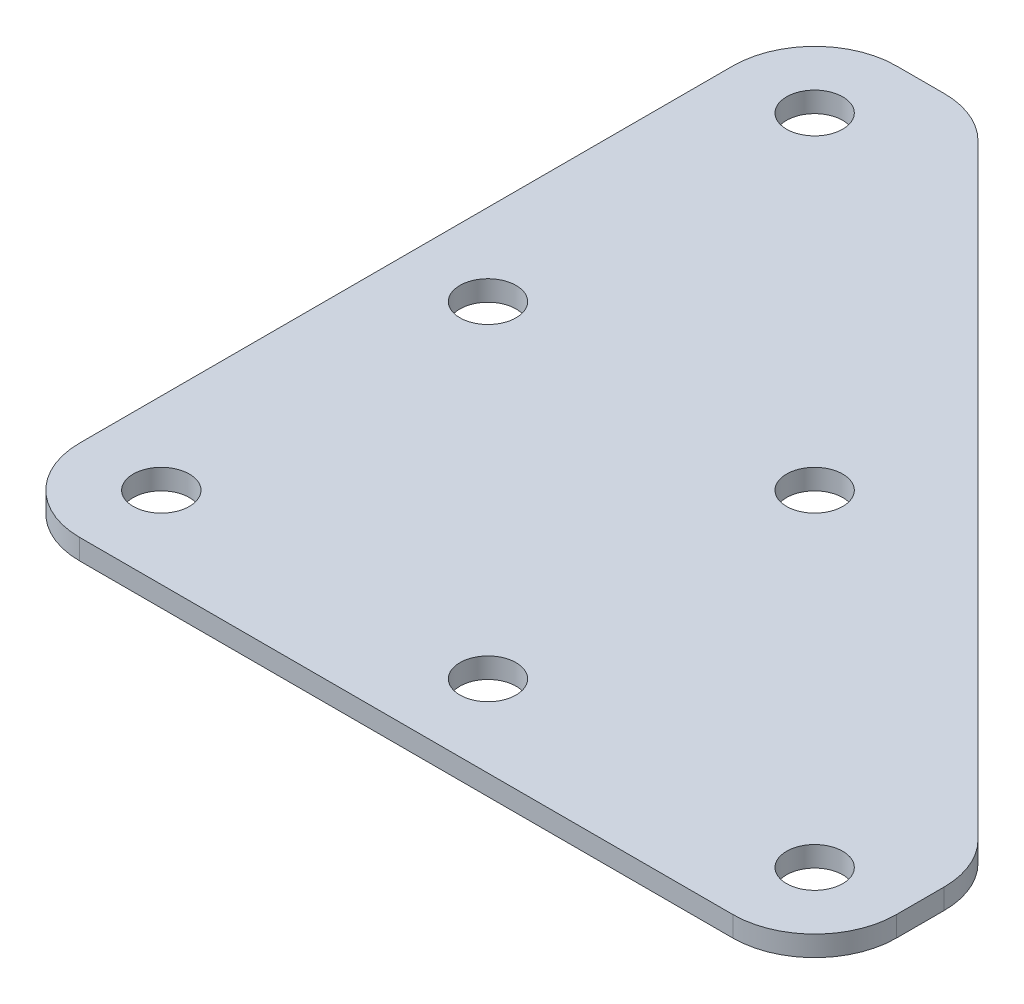
ISO-10303-21;
HEADER;
FILE_DESCRIPTION(('STEP AP214'),'2;1');
FILE_NAME('part.step','',(''),(''),'','','');
FILE_SCHEMA(('AUTOMOTIVE_DESIGN { 1 0 10303 214 1 1 1 1 }'));
ENDSEC;
DATA;
#1=APPLICATION_CONTEXT('core data for automotive mechanical design processes');
#2=APPLICATION_PROTOCOL_DEFINITION('international standard','automotive_design',2000,#1);
#3=PRODUCT_CONTEXT('',#1,'mechanical');
#4=PRODUCT('Part','Part','',(#3));
#5=PRODUCT_RELATED_PRODUCT_CATEGORY('part','',(#4));
#6=PRODUCT_DEFINITION_FORMATION('','',#4);
#7=PRODUCT_DEFINITION_CONTEXT('part definition',#1,'design');
#8=PRODUCT_DEFINITION('design','',#6,#7);
#9=PRODUCT_DEFINITION_SHAPE('','',#8);
#10=(LENGTH_UNIT() NAMED_UNIT(*) SI_UNIT(.MILLI.,.METRE.));
#11=(NAMED_UNIT(*) PLANE_ANGLE_UNIT() SI_UNIT($,.RADIAN.));
#12=(NAMED_UNIT(*) SI_UNIT($,.STERADIAN.) SOLID_ANGLE_UNIT());
#13=UNCERTAINTY_MEASURE_WITH_UNIT(LENGTH_MEASURE(1.E-05),#10,'distance_accuracy_value','');
#14=(GEOMETRIC_REPRESENTATION_CONTEXT(3) GLOBAL_UNCERTAINTY_ASSIGNED_CONTEXT((#13)) GLOBAL_UNIT_ASSIGNED_CONTEXT((#10,
#11,#12)) REPRESENTATION_CONTEXT('',''));
#15=CARTESIAN_POINT('',(0.,0.,0.));
#16=DIRECTION('',(0.,0.,1.));
#17=DIRECTION('',(1.,0.,0.));
#18=AXIS2_PLACEMENT_3D('',#15,#16,#17);
#19=CARTESIAN_POINT('',(50.8,0.79375,0.));
#20=DIRECTION('',(0.,-1.,0.));
#21=DIRECTION('',(0.,0.,-1.));
#22=AXIS2_PLACEMENT_3D('',#19,#20,#21);
#23=PLANE('',#22);
#24=CARTESIAN_POINT('',(50.8,0.79375,0.));
#25=DIRECTION('',(0.,1.,0.));
#26=DIRECTION('',(0.,0.,-1.));
#27=AXIS2_PLACEMENT_3D('',#24,#25,#26);
#28=CIRCLE('',#27,6.35);
#29=CARTESIAN_POINT('',(50.8,0.79375,6.34999999999999));
#30=VERTEX_POINT('',#29);
#31=CARTESIAN_POINT('',(57.15,0.79375,0.));
#32=VERTEX_POINT('',#31);
#33=EDGE_CURVE('E182',#30,#32,#28,.T.);
#34=ORIENTED_EDGE('',*,*,#33,.T.);
#35=DIRECTION('',(0.,0.,-1.));
#36=VECTOR('',#35,1.);
#37=CARTESIAN_POINT('',(57.15,0.79375,-3.71974387893083));
#38=LINE('',#37,#36);
#39=CARTESIAN_POINT('',(57.15,0.79375,-3.71974387893083));
#40=VERTEX_POINT('',#39);
#41=EDGE_CURVE('E106',#32,#40,#38,.T.);
#42=ORIENTED_EDGE('',*,*,#41,.T.);
#43=CARTESIAN_POINT('',(50.8,0.79375,-3.71974387893085));
#44=DIRECTION('',(0.,1.,0.));
#45=DIRECTION('',(0.,0.,-1.));
#46=AXIS2_PLACEMENT_3D('',#43,#44,#45);
#47=CIRCLE('',#46,6.35);
#48=CARTESIAN_POINT('',(55.2901280605346,0.79375,-8.20987193946545));
#49=VERTEX_POINT('',#48);
#50=EDGE_CURVE('E211',#40,#49,#47,.T.);
#51=ORIENTED_EDGE('',*,*,#50,.T.);
#52=DIRECTION('',(-0.707106781186548,0.,-0.707106781186547));
#53=VECTOR('',#52,1.);
#54=CARTESIAN_POINT('',(8.20987193946544,0.79375,-55.2901280605346));
#55=LINE('',#54,#53);
#56=CARTESIAN_POINT('',(8.20987193946544,0.79375,-55.2901280605346));
#57=VERTEX_POINT('',#56);
#58=EDGE_CURVE('E231',#49,#57,#55,.T.);
#59=ORIENTED_EDGE('',*,*,#58,.T.);
#60=CARTESIAN_POINT('',(3.71974387893085,0.79375,-50.8));
#61=DIRECTION('',(0.,1.,0.));
#62=DIRECTION('',(0.,0.,-1.));
#63=AXIS2_PLACEMENT_3D('',#60,#61,#62);
#64=CIRCLE('',#63,6.35);
#65=CARTESIAN_POINT('',(3.71974387893082,0.79375,-57.15));
#66=VERTEX_POINT('',#65);
#67=EDGE_CURVE('E227',#57,#66,#64,.T.);
#68=ORIENTED_EDGE('',*,*,#67,.T.);
#69=DIRECTION('',(-1.,0.,0.));
#70=VECTOR('',#69,1.);
#71=CARTESIAN_POINT('',(0.,0.79375,-57.15));
#72=LINE('',#71,#70);
#73=CARTESIAN_POINT('',(0.,0.79375,-57.15));
#74=VERTEX_POINT('',#73);
#75=EDGE_CURVE('E230',#66,#74,#72,.T.);
#76=ORIENTED_EDGE('',*,*,#75,.T.);
#77=CARTESIAN_POINT('',(0.,0.79375,-50.8));
#78=DIRECTION('',(0.,1.,0.));
#79=DIRECTION('',(0.,0.,-1.));
#80=AXIS2_PLACEMENT_3D('',#77,#78,#79);
#81=CIRCLE('',#80,6.35);
#82=CARTESIAN_POINT('',(-6.35,0.79375,-50.7999999999999));
#83=VERTEX_POINT('',#82);
#84=EDGE_CURVE('E131',#74,#83,#81,.T.);
#85=ORIENTED_EDGE('',*,*,#84,.T.);
#86=DIRECTION('',(0.,0.,1.));
#87=VECTOR('',#86,1.);
#88=CARTESIAN_POINT('',(-6.35,0.79375,0.));
#89=LINE('',#88,#87);
#90=CARTESIAN_POINT('',(-6.35,0.79375,0.));
#91=VERTEX_POINT('',#90);
#92=EDGE_CURVE('E125',#83,#91,#89,.T.);
#93=ORIENTED_EDGE('',*,*,#92,.T.);
#94=CARTESIAN_POINT('',(0.,0.79375,0.));
#95=DIRECTION('',(0.,1.,0.));
#96=DIRECTION('',(0.,0.,1.));
#97=AXIS2_PLACEMENT_3D('',#94,#95,#96);
#98=CIRCLE('',#97,6.35);
#99=CARTESIAN_POINT('',(0.,0.79375,6.35));
#100=VERTEX_POINT('',#99);
#101=EDGE_CURVE('E129',#91,#100,#98,.T.);
#102=ORIENTED_EDGE('',*,*,#101,.T.);
#103=DIRECTION('',(1.,0.,0.));
#104=VECTOR('',#103,1.);
#105=CARTESIAN_POINT('',(50.8,0.79375,6.34999999999999));
#106=LINE('',#105,#104);
#107=EDGE_CURVE('E57',#100,#30,#106,.T.);
#108=ORIENTED_EDGE('',*,*,#107,.T.);
#109=EDGE_LOOP('',(#34,#42,#51,#59,#68,#76,#85,#93,#102,#108));
#110=FACE_BOUND('',#109,.T.);
#111=CARTESIAN_POINT('',(0.,0.79375,0.));
#112=DIRECTION('',(0.,1.,0.));
#113=DIRECTION('',(0.,0.,1.));
#114=AXIS2_PLACEMENT_3D('',#111,#112,#113);
#115=CIRCLE('',#114,2.1828125);
#116=CARTESIAN_POINT('',(0.,0.79375,2.1828125));
#117=VERTEX_POINT('',#116);
#118=EDGE_CURVE('E158',#117,#117,#115,.T.);
#119=ORIENTED_EDGE('',*,*,#118,.F.);
#120=EDGE_LOOP('',(#119));
#121=FACE_BOUND('',#120,.T.);
#122=CARTESIAN_POINT('',(0.,0.79375,-50.8));
#123=DIRECTION('',(0.,1.,0.));
#124=DIRECTION('',(0.,0.,1.));
#125=AXIS2_PLACEMENT_3D('',#122,#123,#124);
#126=CIRCLE('',#125,2.1828125);
#127=CARTESIAN_POINT('',(0.,0.79375,-48.6171875));
#128=VERTEX_POINT('',#127);
#129=EDGE_CURVE('E249',#128,#128,#126,.T.);
#130=ORIENTED_EDGE('',*,*,#129,.F.);
#131=EDGE_LOOP('',(#130));
#132=FACE_BOUND('',#131,.T.);
#133=CARTESIAN_POINT('',(50.8,0.79375,0.));
#134=DIRECTION('',(0.,1.,0.));
#135=DIRECTION('',(0.,0.,1.));
#136=AXIS2_PLACEMENT_3D('',#133,#134,#135);
#137=CIRCLE('',#136,2.1828125);
#138=CARTESIAN_POINT('',(50.8,0.79375,2.1828125));
#139=VERTEX_POINT('',#138);
#140=EDGE_CURVE('E257',#139,#139,#137,.T.);
#141=ORIENTED_EDGE('',*,*,#140,.F.);
#142=EDGE_LOOP('',(#141));
#143=FACE_BOUND('',#142,.T.);
#144=CARTESIAN_POINT('',(0.,0.79375,-25.4));
#145=DIRECTION('',(0.,1.,0.));
#146=DIRECTION('',(0.,0.,1.));
#147=AXIS2_PLACEMENT_3D('',#144,#145,#146);
#148=CIRCLE('',#147,2.1828125);
#149=CARTESIAN_POINT('',(0.,0.79375,-23.2171875));
#150=VERTEX_POINT('',#149);
#151=EDGE_CURVE('E265',#150,#150,#148,.T.);
#152=ORIENTED_EDGE('',*,*,#151,.F.);
#153=EDGE_LOOP('',(#152));
#154=FACE_BOUND('',#153,.T.);
#155=CARTESIAN_POINT('',(25.4,0.79375,0.));
#156=DIRECTION('',(0.,1.,0.));
#157=DIRECTION('',(0.,0.,1.));
#158=AXIS2_PLACEMENT_3D('',#155,#156,#157);
#159=CIRCLE('',#158,2.1828125);
#160=CARTESIAN_POINT('',(25.4,0.79375,2.1828125));
#161=VERTEX_POINT('',#160);
#162=EDGE_CURVE('E273',#161,#161,#159,.T.);
#163=ORIENTED_EDGE('',*,*,#162,.F.);
#164=EDGE_LOOP('',(#163));
#165=FACE_BOUND('',#164,.T.);
#166=CARTESIAN_POINT('',(25.4,0.79375,-25.4));
#167=DIRECTION('',(0.,1.,0.));
#168=DIRECTION('',(0.,0.,1.));
#169=AXIS2_PLACEMENT_3D('',#166,#167,#168);
#170=CIRCLE('',#169,2.1828125);
#171=CARTESIAN_POINT('',(25.4,0.79375,-23.2171875));
#172=VERTEX_POINT('',#171);
#173=EDGE_CURVE('E281',#172,#172,#170,.T.);
#174=ORIENTED_EDGE('',*,*,#173,.F.);
#175=EDGE_LOOP('',(#174));
#176=FACE_BOUND('',#175,.T.);
#177=ADVANCED_FACE('F39',(#110,#121,#132,#143,#154,#165,#176),#23,.F.);
#178=CARTESIAN_POINT('',(50.8,-0.79375,0.));
#179=DIRECTION('',(0.,-1.,0.));
#180=DIRECTION('',(0.,0.,-1.));
#181=AXIS2_PLACEMENT_3D('',#178,#179,#180);
#182=PLANE('',#181);
#183=CARTESIAN_POINT('',(25.4,-0.79375,0.));
#184=DIRECTION('',(0.,1.,0.));
#185=DIRECTION('',(0.,0.,1.));
#186=AXIS2_PLACEMENT_3D('',#183,#184,#185);
#187=CIRCLE('',#186,2.1828125);
#188=CARTESIAN_POINT('',(25.4,-0.79375,2.1828125));
#189=VERTEX_POINT('',#188);
#190=EDGE_CURVE('E277',#189,#189,#187,.T.);
#191=ORIENTED_EDGE('',*,*,#190,.T.);
#192=EDGE_LOOP('',(#191));
#193=FACE_BOUND('',#192,.T.);
#194=CARTESIAN_POINT('',(50.8,-0.79375,0.));
#195=DIRECTION('',(0.,1.,0.));
#196=DIRECTION('',(0.,0.,1.));
#197=AXIS2_PLACEMENT_3D('',#194,#195,#196);
#198=CIRCLE('',#197,2.1828125);
#199=CARTESIAN_POINT('',(50.8,-0.79375,2.1828125));
#200=VERTEX_POINT('',#199);
#201=EDGE_CURVE('E261',#200,#200,#198,.T.);
#202=ORIENTED_EDGE('',*,*,#201,.T.);
#203=EDGE_LOOP('',(#202));
#204=FACE_BOUND('',#203,.T.);
#205=CARTESIAN_POINT('',(0.,-0.79375,0.));
#206=DIRECTION('',(0.,1.,0.));
#207=DIRECTION('',(0.,0.,1.));
#208=AXIS2_PLACEMENT_3D('',#205,#206,#207);
#209=CIRCLE('',#208,2.1828125);
#210=CARTESIAN_POINT('',(0.,-0.79375,2.1828125));
#211=VERTEX_POINT('',#210);
#212=EDGE_CURVE('E245',#211,#211,#209,.T.);
#213=ORIENTED_EDGE('',*,*,#212,.T.);
#214=EDGE_LOOP('',(#213));
#215=FACE_BOUND('',#214,.T.);
#216=CARTESIAN_POINT('',(50.8,-0.79375,0.));
#217=DIRECTION('',(0.,1.,0.));
#218=DIRECTION('',(0.,0.,-1.));
#219=AXIS2_PLACEMENT_3D('',#216,#217,#218);
#220=CIRCLE('',#219,6.35);
#221=CARTESIAN_POINT('',(50.8,-0.79375,6.34999999999999));
#222=VERTEX_POINT('',#221);
#223=CARTESIAN_POINT('',(57.15,-0.79375,0.));
#224=VERTEX_POINT('',#223);
#225=EDGE_CURVE('E153',#222,#224,#220,.T.);
#226=ORIENTED_EDGE('',*,*,#225,.F.);
#227=DIRECTION('',(1.,0.,0.));
#228=VECTOR('',#227,1.);
#229=CARTESIAN_POINT('',(50.8,-0.79375,6.34999999999999));
#230=LINE('',#229,#228);
#231=CARTESIAN_POINT('',(0.,-0.79375,6.35));
#232=VERTEX_POINT('',#231);
#233=EDGE_CURVE('E98',#232,#222,#230,.T.);
#234=ORIENTED_EDGE('',*,*,#233,.F.);
#235=CARTESIAN_POINT('',(0.,-0.79375,0.));
#236=DIRECTION('',(0.,1.,0.));
#237=DIRECTION('',(0.,0.,1.));
#238=AXIS2_PLACEMENT_3D('',#235,#236,#237);
#239=CIRCLE('',#238,6.35);
#240=CARTESIAN_POINT('',(-6.35,-0.79375,0.));
#241=VERTEX_POINT('',#240);
#242=EDGE_CURVE('E92',#241,#232,#239,.T.);
#243=ORIENTED_EDGE('',*,*,#242,.F.);
#244=DIRECTION('',(0.,0.,1.));
#245=VECTOR('',#244,1.);
#246=CARTESIAN_POINT('',(-6.35,-0.79375,0.));
#247=LINE('',#246,#245);
#248=CARTESIAN_POINT('',(-6.35,-0.79375,-50.7999999999999));
#249=VERTEX_POINT('',#248);
#250=EDGE_CURVE('E140',#249,#241,#247,.T.);
#251=ORIENTED_EDGE('',*,*,#250,.F.);
#252=CARTESIAN_POINT('',(0.,-0.79375,-50.8));
#253=DIRECTION('',(0.,1.,0.));
#254=DIRECTION('',(0.,0.,-1.));
#255=AXIS2_PLACEMENT_3D('',#252,#253,#254);
#256=CIRCLE('',#255,6.35);
#257=CARTESIAN_POINT('',(0.,-0.79375,-57.15));
#258=VERTEX_POINT('',#257);
#259=EDGE_CURVE('E173',#258,#249,#256,.T.);
#260=ORIENTED_EDGE('',*,*,#259,.F.);
#261=DIRECTION('',(-1.,0.,0.));
#262=VECTOR('',#261,1.);
#263=CARTESIAN_POINT('',(0.,-0.79375,-57.15));
#264=LINE('',#263,#262);
#265=CARTESIAN_POINT('',(3.71974387893082,-0.79375,-57.15));
#266=VERTEX_POINT('',#265);
#267=EDGE_CURVE('E170',#266,#258,#264,.T.);
#268=ORIENTED_EDGE('',*,*,#267,.F.);
#269=CARTESIAN_POINT('',(3.71974387893085,-0.79375,-50.8));
#270=DIRECTION('',(0.,1.,0.));
#271=DIRECTION('',(0.,0.,-1.));
#272=AXIS2_PLACEMENT_3D('',#269,#270,#271);
#273=CIRCLE('',#272,6.35);
#274=CARTESIAN_POINT('',(8.20987193946544,-0.79375,-55.2901280605346));
#275=VERTEX_POINT('',#274);
#276=EDGE_CURVE('E167',#275,#266,#273,.T.);
#277=ORIENTED_EDGE('',*,*,#276,.F.);
#278=DIRECTION('',(-0.707106781186548,0.,-0.707106781186547));
#279=VECTOR('',#278,1.);
#280=CARTESIAN_POINT('',(8.20987193946544,-0.79375,-55.2901280605346));
#281=LINE('',#280,#279);
#282=CARTESIAN_POINT('',(55.2901280605346,-0.79375,-8.20987193946545));
#283=VERTEX_POINT('',#282);
#284=EDGE_CURVE('E164',#283,#275,#281,.T.);
#285=ORIENTED_EDGE('',*,*,#284,.F.);
#286=CARTESIAN_POINT('',(50.8,-0.79375,-3.71974387893085));
#287=DIRECTION('',(0.,1.,0.));
#288=DIRECTION('',(0.,0.,-1.));
#289=AXIS2_PLACEMENT_3D('',#286,#287,#288);
#290=CIRCLE('',#289,6.35);
#291=CARTESIAN_POINT('',(57.15,-0.79375,-3.71974387893083));
#292=VERTEX_POINT('',#291);
#293=EDGE_CURVE('E161',#292,#283,#290,.T.);
#294=ORIENTED_EDGE('',*,*,#293,.F.);
#295=DIRECTION('',(0.,0.,-1.));
#296=VECTOR('',#295,1.);
#297=CARTESIAN_POINT('',(57.15,-0.79375,-3.71974387893083));
#298=LINE('',#297,#296);
#299=EDGE_CURVE('E157',#224,#292,#298,.T.);
#300=ORIENTED_EDGE('',*,*,#299,.F.);
#301=EDGE_LOOP('',(#226,#234,#243,#251,#260,#268,#277,#285,#294,#300));
#302=FACE_BOUND('',#301,.T.);
#303=CARTESIAN_POINT('',(0.,-0.79375,-50.8));
#304=DIRECTION('',(0.,1.,0.));
#305=DIRECTION('',(0.,0.,1.));
#306=AXIS2_PLACEMENT_3D('',#303,#304,#305);
#307=CIRCLE('',#306,2.1828125);
#308=CARTESIAN_POINT('',(0.,-0.79375,-48.6171875));
#309=VERTEX_POINT('',#308);
#310=EDGE_CURVE('E253',#309,#309,#307,.T.);
#311=ORIENTED_EDGE('',*,*,#310,.T.);
#312=EDGE_LOOP('',(#311));
#313=FACE_BOUND('',#312,.T.);
#314=CARTESIAN_POINT('',(0.,-0.79375,-25.4));
#315=DIRECTION('',(0.,1.,0.));
#316=DIRECTION('',(0.,0.,1.));
#317=AXIS2_PLACEMENT_3D('',#314,#315,#316);
#318=CIRCLE('',#317,2.1828125);
#319=CARTESIAN_POINT('',(0.,-0.79375,-23.2171875));
#320=VERTEX_POINT('',#319);
#321=EDGE_CURVE('E269',#320,#320,#318,.T.);
#322=ORIENTED_EDGE('',*,*,#321,.T.);
#323=EDGE_LOOP('',(#322));
#324=FACE_BOUND('',#323,.T.);
#325=CARTESIAN_POINT('',(25.4,-0.79375,-25.4));
#326=DIRECTION('',(0.,1.,0.));
#327=DIRECTION('',(0.,0.,1.));
#328=AXIS2_PLACEMENT_3D('',#325,#326,#327);
#329=CIRCLE('',#328,2.1828125);
#330=CARTESIAN_POINT('',(25.4,-0.79375,-23.2171875));
#331=VERTEX_POINT('',#330);
#332=EDGE_CURVE('E285',#331,#331,#329,.T.);
#333=ORIENTED_EDGE('',*,*,#332,.T.);
#334=EDGE_LOOP('',(#333));
#335=FACE_BOUND('',#334,.T.);
#336=ADVANCED_FACE('F215',(#193,#204,#215,#302,#313,#324,#335),#182,.T.);
#337=CARTESIAN_POINT('',(50.8,0.79375,0.));
#338=DIRECTION('',(0.,-1.,0.));
#339=DIRECTION('',(0.,0.,-1.));
#340=AXIS2_PLACEMENT_3D('',#337,#338,#339);
#341=CYLINDRICAL_SURFACE('',#340,6.35);
#342=ORIENTED_EDGE('',*,*,#225,.T.);
#343=DIRECTION('',(0.,-1.,0.));
#344=VECTOR('',#343,1.);
#345=CARTESIAN_POINT('',(57.15,0.79375,0.));
#346=LINE('',#345,#344);
#347=EDGE_CURVE('E11',#32,#224,#346,.T.);
#348=ORIENTED_EDGE('',*,*,#347,.F.);
#349=ORIENTED_EDGE('',*,*,#33,.F.);
#350=DIRECTION('',(0.,-1.,0.));
#351=VECTOR('',#350,1.);
#352=CARTESIAN_POINT('',(50.8,0.79375,6.34999999999999));
#353=LINE('',#352,#351);
#354=EDGE_CURVE('E149',#30,#222,#353,.T.);
#355=ORIENTED_EDGE('',*,*,#354,.T.);
#356=EDGE_LOOP('',(#342,#348,#349,#355));
#357=FACE_BOUND('',#356,.T.);
#358=ADVANCED_FACE('F41',(#357),#341,.T.);
#359=CARTESIAN_POINT('',(57.15,0.79375,-3.71974387893083));
#360=DIRECTION('',(-1.,0.,0.));
#361=DIRECTION('',(0.,0.,1.));
#362=AXIS2_PLACEMENT_3D('',#359,#360,#361);
#363=PLANE('',#362);
#364=ORIENTED_EDGE('',*,*,#299,.T.);
#365=DIRECTION('',(0.,-1.,0.));
#366=VECTOR('',#365,1.);
#367=CARTESIAN_POINT('',(57.15,0.79375,-3.71974387893083));
#368=LINE('',#367,#366);
#369=EDGE_CURVE('E49',#40,#292,#368,.T.);
#370=ORIENTED_EDGE('',*,*,#369,.F.);
#371=ORIENTED_EDGE('',*,*,#41,.F.);
#372=ORIENTED_EDGE('',*,*,#347,.T.);
#373=EDGE_LOOP('',(#364,#370,#371,#372));
#374=FACE_BOUND('',#373,.T.);
#375=ADVANCED_FACE('F327',(#374),#363,.F.);
#376=CARTESIAN_POINT('',(50.8,0.79375,-3.71974387893085));
#377=DIRECTION('',(0.,-1.,0.));
#378=DIRECTION('',(0.,0.,-1.));
#379=AXIS2_PLACEMENT_3D('',#376,#377,#378);
#380=CYLINDRICAL_SURFACE('',#379,6.35);
#381=ORIENTED_EDGE('',*,*,#293,.T.);
#382=DIRECTION('',(0.,-1.,0.));
#383=VECTOR('',#382,1.);
#384=CARTESIAN_POINT('',(55.2901280605346,0.79375,-8.20987193946545));
#385=LINE('',#384,#383);
#386=EDGE_CURVE('E201',#49,#283,#385,.T.);
#387=ORIENTED_EDGE('',*,*,#386,.F.);
#388=ORIENTED_EDGE('',*,*,#50,.F.);
#389=ORIENTED_EDGE('',*,*,#369,.T.);
#390=EDGE_LOOP('',(#381,#387,#388,#389));
#391=FACE_BOUND('',#390,.T.);
#392=ADVANCED_FACE('F209',(#391),#380,.T.);
#393=CARTESIAN_POINT('',(8.20987193946544,0.79375,-55.2901280605346));
#394=DIRECTION('',(-0.707106781186547,0.,0.707106781186548));
#395=DIRECTION('',(0.707106781186548,0.,0.707106781186547));
#396=AXIS2_PLACEMENT_3D('',#393,#394,#395);
#397=PLANE('',#396);
#398=ORIENTED_EDGE('',*,*,#284,.T.);
#399=DIRECTION('',(0.,-1.,0.));
#400=VECTOR('',#399,1.);
#401=CARTESIAN_POINT('',(8.20987193946544,0.79375,-55.2901280605346));
#402=LINE('',#401,#400);
#403=EDGE_CURVE('E197',#57,#275,#402,.T.);
#404=ORIENTED_EDGE('',*,*,#403,.F.);
#405=ORIENTED_EDGE('',*,*,#58,.F.);
#406=ORIENTED_EDGE('',*,*,#386,.T.);
#407=EDGE_LOOP('',(#398,#404,#405,#406));
#408=FACE_BOUND('',#407,.T.);
#409=ADVANCED_FACE('F221',(#408),#397,.F.);
#410=CARTESIAN_POINT('',(3.71974387893085,0.79375,-50.8));
#411=DIRECTION('',(0.,-1.,0.));
#412=DIRECTION('',(0.,0.,-1.));
#413=AXIS2_PLACEMENT_3D('',#410,#411,#412);
#414=CYLINDRICAL_SURFACE('',#413,6.35);
#415=ORIENTED_EDGE('',*,*,#276,.T.);
#416=DIRECTION('',(0.,-1.,0.));
#417=VECTOR('',#416,1.);
#418=CARTESIAN_POINT('',(3.71974387893082,0.79375,-57.15));
#419=LINE('',#418,#417);
#420=EDGE_CURVE('E193',#66,#266,#419,.T.);
#421=ORIENTED_EDGE('',*,*,#420,.F.);
#422=ORIENTED_EDGE('',*,*,#67,.F.);
#423=ORIENTED_EDGE('',*,*,#403,.T.);
#424=EDGE_LOOP('',(#415,#421,#422,#423));
#425=FACE_BOUND('',#424,.T.);
#426=ADVANCED_FACE('F225',(#425),#414,.T.);
#427=CARTESIAN_POINT('',(0.,0.79375,-57.15));
#428=DIRECTION('',(0.,0.,1.));
#429=DIRECTION('',(1.,0.,0.));
#430=AXIS2_PLACEMENT_3D('',#427,#428,#429);
#431=PLANE('',#430);
#432=ORIENTED_EDGE('',*,*,#267,.T.);
#433=DIRECTION('',(0.,-1.,0.));
#434=VECTOR('',#433,1.);
#435=CARTESIAN_POINT('',(0.,0.79375,-57.15));
#436=LINE('',#435,#434);
#437=EDGE_CURVE('E189',#74,#258,#436,.T.);
#438=ORIENTED_EDGE('',*,*,#437,.F.);
#439=ORIENTED_EDGE('',*,*,#75,.F.);
#440=ORIENTED_EDGE('',*,*,#420,.T.);
#441=EDGE_LOOP('',(#432,#438,#439,#440));
#442=FACE_BOUND('',#441,.T.);
#443=ADVANCED_FACE('F317',(#442),#431,.F.);
#444=CARTESIAN_POINT('',(0.,0.79375,-50.8));
#445=DIRECTION('',(0.,-1.,0.));
#446=DIRECTION('',(0.,0.,-1.));
#447=AXIS2_PLACEMENT_3D('',#444,#445,#446);
#448=CYLINDRICAL_SURFACE('',#447,6.35);
#449=ORIENTED_EDGE('',*,*,#259,.T.);
#450=DIRECTION('',(0.,-1.,0.));
#451=VECTOR('',#450,1.);
#452=CARTESIAN_POINT('',(-6.35,0.79375,-50.7999999999999));
#453=LINE('',#452,#451);
#454=EDGE_CURVE('E142',#83,#249,#453,.T.);
#455=ORIENTED_EDGE('',*,*,#454,.F.);
#456=ORIENTED_EDGE('',*,*,#84,.F.);
#457=ORIENTED_EDGE('',*,*,#437,.T.);
#458=EDGE_LOOP('',(#449,#455,#456,#457));
#459=FACE_BOUND('',#458,.T.);
#460=ADVANCED_FACE('F314',(#459),#448,.T.);
#461=CARTESIAN_POINT('',(-6.35,0.79375,0.));
#462=DIRECTION('',(1.,0.,0.));
#463=DIRECTION('',(0.,0.,-1.));
#464=AXIS2_PLACEMENT_3D('',#461,#462,#463);
#465=PLANE('',#464);
#466=ORIENTED_EDGE('',*,*,#250,.T.);
#467=DIRECTION('',(0.,-1.,0.));
#468=VECTOR('',#467,1.);
#469=CARTESIAN_POINT('',(-6.35,0.79375,0.));
#470=LINE('',#469,#468);
#471=EDGE_CURVE('E137',#91,#241,#470,.T.);
#472=ORIENTED_EDGE('',*,*,#471,.F.);
#473=ORIENTED_EDGE('',*,*,#92,.F.);
#474=ORIENTED_EDGE('',*,*,#454,.T.);
#475=EDGE_LOOP('',(#466,#472,#473,#474));
#476=FACE_BOUND('',#475,.T.);
#477=ADVANCED_FACE('F138',(#476),#465,.F.);
#478=CARTESIAN_POINT('',(0.,0.79375,0.));
#479=DIRECTION('',(0.,-1.,0.));
#480=DIRECTION('',(0.,0.,-1.));
#481=AXIS2_PLACEMENT_3D('',#478,#479,#480);
#482=CYLINDRICAL_SURFACE('',#481,6.35);
#483=ORIENTED_EDGE('',*,*,#242,.T.);
#484=DIRECTION('',(0.,-1.,0.));
#485=VECTOR('',#484,1.);
#486=CARTESIAN_POINT('',(0.,0.79375,6.35));
#487=LINE('',#486,#485);
#488=EDGE_CURVE('E143',#100,#232,#487,.T.);
#489=ORIENTED_EDGE('',*,*,#488,.F.);
#490=ORIENTED_EDGE('',*,*,#101,.F.);
#491=ORIENTED_EDGE('',*,*,#471,.T.);
#492=EDGE_LOOP('',(#483,#489,#490,#491));
#493=FACE_BOUND('',#492,.T.);
#494=ADVANCED_FACE('F145',(#493),#482,.T.);
#495=CARTESIAN_POINT('',(50.8,0.79375,6.34999999999999));
#496=DIRECTION('',(0.,0.,-1.));
#497=DIRECTION('',(-1.,0.,0.));
#498=AXIS2_PLACEMENT_3D('',#495,#496,#497);
#499=PLANE('',#498);
#500=ORIENTED_EDGE('',*,*,#233,.T.);
#501=ORIENTED_EDGE('',*,*,#354,.F.);
#502=ORIENTED_EDGE('',*,*,#107,.F.);
#503=ORIENTED_EDGE('',*,*,#488,.T.);
#504=EDGE_LOOP('',(#500,#501,#502,#503));
#505=FACE_BOUND('',#504,.T.);
#506=ADVANCED_FACE('F307',(#505),#499,.F.);
#507=CARTESIAN_POINT('',(0.,0.79375,0.));
#508=DIRECTION('',(0.,-1.,0.));
#509=DIRECTION('',(0.,0.,-1.));
#510=AXIS2_PLACEMENT_3D('',#507,#508,#509);
#511=CYLINDRICAL_SURFACE('',#510,2.1828125);
#512=ORIENTED_EDGE('',*,*,#118,.T.);
#513=EDGE_LOOP('',(#512));
#514=FACE_BOUND('',#513,.T.);
#515=ORIENTED_EDGE('',*,*,#212,.F.);
#516=EDGE_LOOP('',(#515));
#517=FACE_BOUND('',#516,.T.);
#518=ADVANCED_FACE('F304',(#514,#517),#511,.F.);
#519=CARTESIAN_POINT('',(0.,0.79375,-50.8));
#520=DIRECTION('',(0.,-1.,0.));
#521=DIRECTION('',(0.,0.,-1.));
#522=AXIS2_PLACEMENT_3D('',#519,#520,#521);
#523=CYLINDRICAL_SURFACE('',#522,2.1828125);
#524=ORIENTED_EDGE('',*,*,#129,.T.);
#525=EDGE_LOOP('',(#524));
#526=FACE_BOUND('',#525,.T.);
#527=ORIENTED_EDGE('',*,*,#310,.F.);
#528=EDGE_LOOP('',(#527));
#529=FACE_BOUND('',#528,.T.);
#530=ADVANCED_FACE('F403',(#526,#529),#523,.F.);
#531=CARTESIAN_POINT('',(50.8,0.79375,0.));
#532=DIRECTION('',(0.,-1.,0.));
#533=DIRECTION('',(0.,0.,-1.));
#534=AXIS2_PLACEMENT_3D('',#531,#532,#533);
#535=CYLINDRICAL_SURFACE('',#534,2.1828125);
#536=ORIENTED_EDGE('',*,*,#140,.T.);
#537=EDGE_LOOP('',(#536));
#538=FACE_BOUND('',#537,.T.);
#539=ORIENTED_EDGE('',*,*,#201,.F.);
#540=EDGE_LOOP('',(#539));
#541=FACE_BOUND('',#540,.T.);
#542=ADVANCED_FACE('F411',(#538,#541),#535,.F.);
#543=CARTESIAN_POINT('',(0.,0.79375,-25.4));
#544=DIRECTION('',(0.,-1.,0.));
#545=DIRECTION('',(0.,0.,-1.));
#546=AXIS2_PLACEMENT_3D('',#543,#544,#545);
#547=CYLINDRICAL_SURFACE('',#546,2.1828125);
#548=ORIENTED_EDGE('',*,*,#151,.T.);
#549=EDGE_LOOP('',(#548));
#550=FACE_BOUND('',#549,.T.);
#551=ORIENTED_EDGE('',*,*,#321,.F.);
#552=EDGE_LOOP('',(#551));
#553=FACE_BOUND('',#552,.T.);
#554=ADVANCED_FACE('F419',(#550,#553),#547,.F.);
#555=CARTESIAN_POINT('',(25.4,0.79375,0.));
#556=DIRECTION('',(0.,-1.,0.));
#557=DIRECTION('',(0.,0.,-1.));
#558=AXIS2_PLACEMENT_3D('',#555,#556,#557);
#559=CYLINDRICAL_SURFACE('',#558,2.1828125);
#560=ORIENTED_EDGE('',*,*,#162,.T.);
#561=EDGE_LOOP('',(#560));
#562=FACE_BOUND('',#561,.T.);
#563=ORIENTED_EDGE('',*,*,#190,.F.);
#564=EDGE_LOOP('',(#563));
#565=FACE_BOUND('',#564,.T.);
#566=ADVANCED_FACE('F428',(#562,#565),#559,.F.);
#567=CARTESIAN_POINT('',(25.4,0.79375,-25.4));
#568=DIRECTION('',(0.,-1.,0.));
#569=DIRECTION('',(0.,0.,-1.));
#570=AXIS2_PLACEMENT_3D('',#567,#568,#569);
#571=CYLINDRICAL_SURFACE('',#570,2.1828125);
#572=ORIENTED_EDGE('',*,*,#173,.T.);
#573=EDGE_LOOP('',(#572));
#574=FACE_BOUND('',#573,.T.);
#575=ORIENTED_EDGE('',*,*,#332,.F.);
#576=EDGE_LOOP('',(#575));
#577=FACE_BOUND('',#576,.T.);
#578=ADVANCED_FACE('F293',(#574,#577),#571,.F.);
#579=CLOSED_SHELL('',(#177,#336,#358,#375,#392,#409,#426,#443,#460,#477,#494,#506,#518,#530,
#542,#554,#566,#578));
#580=MANIFOLD_SOLID_BREP('B2',#579);
#581=ADVANCED_BREP_SHAPE_REPRESENTATION('',(#18,#580),#14);
#582=SHAPE_DEFINITION_REPRESENTATION(#9,#581);
ENDSEC;
END-ISO-10303-21;
